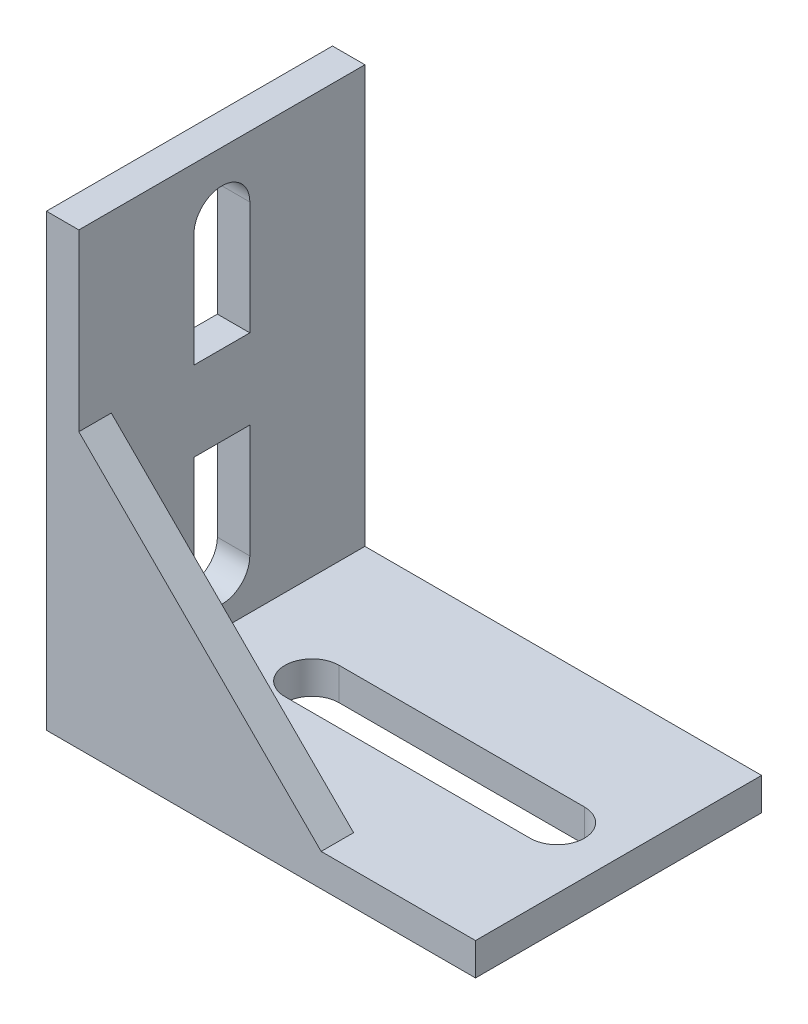
ISO-10303-21;
HEADER;
FILE_DESCRIPTION(('STEP AP214'),'2;1');
FILE_NAME('part.step','',(''),(''),'','','');
FILE_SCHEMA(('AUTOMOTIVE_DESIGN { 1 0 10303 214 1 1 1 1 }'));
ENDSEC;
DATA;
#1=APPLICATION_CONTEXT('core data for automotive mechanical design processes');
#2=APPLICATION_PROTOCOL_DEFINITION('international standard','automotive_design',2000,#1);
#3=PRODUCT_CONTEXT('',#1,'mechanical');
#4=PRODUCT('Part','Part','',(#3));
#5=PRODUCT_RELATED_PRODUCT_CATEGORY('part','',(#4));
#6=PRODUCT_DEFINITION_FORMATION('','',#4);
#7=PRODUCT_DEFINITION_CONTEXT('part definition',#1,'design');
#8=PRODUCT_DEFINITION('design','',#6,#7);
#9=PRODUCT_DEFINITION_SHAPE('','',#8);
#10=(LENGTH_UNIT() NAMED_UNIT(*) SI_UNIT(.MILLI.,.METRE.));
#11=(NAMED_UNIT(*) PLANE_ANGLE_UNIT() SI_UNIT($,.RADIAN.));
#12=(NAMED_UNIT(*) SI_UNIT($,.STERADIAN.) SOLID_ANGLE_UNIT());
#13=UNCERTAINTY_MEASURE_WITH_UNIT(LENGTH_MEASURE(1.E-05),#10,'distance_accuracy_value','');
#14=(GEOMETRIC_REPRESENTATION_CONTEXT(3) GLOBAL_UNCERTAINTY_ASSIGNED_CONTEXT((#13)) GLOBAL_UNIT_ASSIGNED_CONTEXT((#10,
#11,#12)) REPRESENTATION_CONTEXT('',''));
#15=CARTESIAN_POINT('',(0.,0.,0.));
#16=DIRECTION('',(0.,0.,1.));
#17=DIRECTION('',(1.,0.,0.));
#18=AXIS2_PLACEMENT_3D('',#15,#16,#17);
#19=CARTESIAN_POINT('',(7.9375,0.,0.));
#20=DIRECTION('',(1.,0.,0.));
#21=DIRECTION('',(0.,0.,-1.));
#22=AXIS2_PLACEMENT_3D('',#19,#20,#21);
#23=PLANE('',#22);
#24=DIRECTION('',(0.,-1.,0.));
#25=VECTOR('',#24,1.);
#26=CARTESIAN_POINT('',(7.9375,0.,6.83482912030962));
#27=LINE('',#26,#25);
#28=CARTESIAN_POINT('',(7.9375,17.7337008180858,6.83482912030962));
#29=VERTEX_POINT('',#28);
#30=CARTESIAN_POINT('',(7.9375,-10.,6.83482912030962));
#31=VERTEX_POINT('',#30);
#32=EDGE_CURVE('E240',#29,#31,#27,.T.);
#33=ORIENTED_EDGE('',*,*,#32,.F.);
#34=DIRECTION('',(0.,0.,-1.));
#35=VECTOR('',#34,1.);
#36=CARTESIAN_POINT('',(7.9375,17.7337008180858,0.));
#37=LINE('',#36,#35);
#38=CARTESIAN_POINT('',(7.9375,17.7337008180858,-6.83482912030964));
#39=VERTEX_POINT('',#38);
#40=EDGE_CURVE('E243',#29,#39,#37,.T.);
#41=ORIENTED_EDGE('',*,*,#40,.T.);
#42=DIRECTION('',(0.,-1.,0.));
#43=VECTOR('',#42,1.);
#44=CARTESIAN_POINT('',(7.9375,0.,-6.83482912030964));
#45=LINE('',#44,#43);
#46=CARTESIAN_POINT('',(7.9375,-9.99999999999999,-6.83482912030964));
#47=VERTEX_POINT('',#46);
#48=EDGE_CURVE('E247',#39,#47,#45,.T.);
#49=ORIENTED_EDGE('',*,*,#48,.T.);
#50=CARTESIAN_POINT('',(7.9375,-9.99999999999999,0.));
#51=DIRECTION('',(1.,0.,0.));
#52=DIRECTION('',(0.,0.,-1.));
#53=AXIS2_PLACEMENT_3D('',#50,#51,#52);
#54=CIRCLE('',#53,6.83482912030963);
#55=EDGE_CURVE('E249',#31,#47,#54,.T.);
#56=ORIENTED_EDGE('',*,*,#55,.F.);
#57=EDGE_LOOP('',(#33,#41,#49,#56));
#58=FACE_BOUND('',#57,.T.);
#59=DIRECTION('',(0.,0.,-1.));
#60=VECTOR('',#59,1.);
#61=CARTESIAN_POINT('',(7.9375,37.2662991819142,0.));
#62=LINE('',#61,#60);
#63=CARTESIAN_POINT('',(7.9375,37.2662991819142,6.83482912030963));
#64=VERTEX_POINT('',#63);
#65=CARTESIAN_POINT('',(7.9375,37.2662991819142,-6.83482912030963));
#66=VERTEX_POINT('',#65);
#67=EDGE_CURVE('E253',#64,#66,#62,.T.);
#68=ORIENTED_EDGE('',*,*,#67,.F.);
#69=CARTESIAN_POINT('',(7.9375,65.,6.83482912030963));
#70=VERTEX_POINT('',#69);
#71=EDGE_CURVE('E245',#70,#64,#27,.T.);
#72=ORIENTED_EDGE('',*,*,#71,.F.);
#73=CARTESIAN_POINT('',(7.9375,65.,0.));
#74=DIRECTION('',(1.,0.,0.));
#75=DIRECTION('',(0.,0.,-1.));
#76=AXIS2_PLACEMENT_3D('',#73,#74,#75);
#77=CIRCLE('',#76,6.83482912030963);
#78=CARTESIAN_POINT('',(7.9375,65.,-6.83482912030963));
#79=VERTEX_POINT('',#78);
#80=EDGE_CURVE('E256',#79,#70,#77,.T.);
#81=ORIENTED_EDGE('',*,*,#80,.F.);
#82=EDGE_CURVE('E250',#79,#66,#45,.T.);
#83=ORIENTED_EDGE('',*,*,#82,.T.);
#84=EDGE_LOOP('',(#68,#72,#81,#83));
#85=FACE_BOUND('',#84,.T.);
#86=DIRECTION('',(0.,-1.,0.));
#87=VECTOR('',#86,1.);
#88=CARTESIAN_POINT('',(7.9375,0.,35.));
#89=LINE('',#88,#87);
#90=CARTESIAN_POINT('',(7.9375,80.,35.));
#91=VERTEX_POINT('',#90);
#92=CARTESIAN_POINT('',(7.9375,37.2289289259256,35.));
#93=VERTEX_POINT('',#92);
#94=EDGE_CURVE('E55',#91,#93,#89,.T.);
#95=ORIENTED_EDGE('',*,*,#94,.T.);
#96=DIRECTION('',(0.,0.,-1.));
#97=VECTOR('',#96,1.);
#98=CARTESIAN_POINT('',(7.9375,37.2289289259256,0.));
#99=LINE('',#98,#97);
#100=CARTESIAN_POINT('',(7.9375,37.2289289259256,27.0625));
#101=VERTEX_POINT('',#100);
#102=EDGE_CURVE('E50',#93,#101,#99,.T.);
#103=ORIENTED_EDGE('',*,*,#102,.T.);
#104=DIRECTION('',(0.,-1.,0.));
#105=VECTOR('',#104,1.);
#106=CARTESIAN_POINT('',(7.9375,0.,27.0625));
#107=LINE('',#106,#105);
#108=CARTESIAN_POINT('',(7.9375,-22.0625,27.0625));
#109=VERTEX_POINT('',#108);
#110=EDGE_CURVE('E193',#101,#109,#107,.T.);
#111=ORIENTED_EDGE('',*,*,#110,.T.);
#112=DIRECTION('',(0.,0.,1.));
#113=VECTOR('',#112,1.);
#114=CARTESIAN_POINT('',(7.9375,-22.0625,0.));
#115=LINE('',#114,#113);
#116=CARTESIAN_POINT('',(7.9375,-22.0625,-35.));
#117=VERTEX_POINT('',#116);
#118=EDGE_CURVE('E181',#117,#109,#115,.T.);
#119=ORIENTED_EDGE('',*,*,#118,.F.);
#120=DIRECTION('',(0.,-1.,0.));
#121=VECTOR('',#120,1.);
#122=CARTESIAN_POINT('',(7.9375,0.,-35.));
#123=LINE('',#122,#121);
#124=CARTESIAN_POINT('',(7.9375,80.,-35.));
#125=VERTEX_POINT('',#124);
#126=EDGE_CURVE('E259',#125,#117,#123,.T.);
#127=ORIENTED_EDGE('',*,*,#126,.F.);
#128=DIRECTION('',(0.,0.,-1.));
#129=VECTOR('',#128,1.);
#130=CARTESIAN_POINT('',(7.9375,80.,0.));
#131=LINE('',#130,#129);
#132=EDGE_CURVE('E262',#91,#125,#131,.T.);
#133=ORIENTED_EDGE('',*,*,#132,.F.);
#134=EDGE_LOOP('',(#95,#103,#111,#119,#127,#133));
#135=FACE_BOUND('',#134,.T.);
#136=ADVANCED_FACE('F35',(#58,#85,#135),#23,.T.);
#137=CARTESIAN_POINT('',(0.,-22.0625,0.));
#138=DIRECTION('',(0.,-1.,0.));
#139=DIRECTION('',(0.,0.,-1.));
#140=AXIS2_PLACEMENT_3D('',#137,#138,#139);
#141=PLANE('',#140);
#142=CARTESIAN_POINT('',(90.,-22.0625,0.));
#143=DIRECTION('',(0.,-1.,0.));
#144=DIRECTION('',(0.,0.,-1.));
#145=AXIS2_PLACEMENT_3D('',#142,#143,#144);
#146=CIRCLE('',#145,6.64034916170633);
#147=CARTESIAN_POINT('',(90.,-22.0625,-6.64034916170633));
#148=VERTEX_POINT('',#147);
#149=CARTESIAN_POINT('',(90.,-22.0625,6.64034916170633));
#150=VERTEX_POINT('',#149);
#151=EDGE_CURVE('E199',#148,#150,#146,.T.);
#152=ORIENTED_EDGE('',*,*,#151,.T.);
#153=DIRECTION('',(1.,0.,0.));
#154=VECTOR('',#153,1.);
#155=CARTESIAN_POINT('',(0.,-22.0625,6.64034916170633));
#156=LINE('',#155,#154);
#157=CARTESIAN_POINT('',(30.,-22.0625,6.64034916170633));
#158=VERTEX_POINT('',#157);
#159=EDGE_CURVE('E206',#158,#150,#156,.T.);
#160=ORIENTED_EDGE('',*,*,#159,.F.);
#161=CARTESIAN_POINT('',(30.,-22.0625,0.));
#162=DIRECTION('',(0.,-1.,0.));
#163=DIRECTION('',(0.,0.,-1.));
#164=AXIS2_PLACEMENT_3D('',#161,#162,#163);
#165=CIRCLE('',#164,6.64034916170633);
#166=CARTESIAN_POINT('',(30.,-22.0625,-6.64034916170633));
#167=VERTEX_POINT('',#166);
#168=EDGE_CURVE('E204',#158,#167,#165,.T.);
#169=ORIENTED_EDGE('',*,*,#168,.T.);
#170=DIRECTION('',(1.,0.,0.));
#171=VECTOR('',#170,1.);
#172=CARTESIAN_POINT('',(0.,-22.0625,-6.64034916170633));
#173=LINE('',#172,#171);
#174=EDGE_CURVE('E201',#167,#148,#173,.T.);
#175=ORIENTED_EDGE('',*,*,#174,.T.);
#176=EDGE_LOOP('',(#152,#160,#169,#175));
#177=FACE_BOUND('',#176,.T.);
#178=DIRECTION('',(0.,0.,-1.));
#179=VECTOR('',#178,1.);
#180=CARTESIAN_POINT('',(67.2289289259262,-22.0625,0.));
#181=LINE('',#180,#179);
#182=CARTESIAN_POINT('',(67.2289289259262,-22.0625,35.));
#183=VERTEX_POINT('',#182);
#184=CARTESIAN_POINT('',(67.2289289259262,-22.0625,27.0625));
#185=VERTEX_POINT('',#184);
#186=EDGE_CURVE('E11',#183,#185,#181,.T.);
#187=ORIENTED_EDGE('',*,*,#186,.F.);
#188=DIRECTION('',(1.,0.,0.));
#189=VECTOR('',#188,1.);
#190=CARTESIAN_POINT('',(0.,-22.0625,35.));
#191=LINE('',#190,#189);
#192=CARTESIAN_POINT('',(105.,-22.0625,35.));
#193=VERTEX_POINT('',#192);
#194=EDGE_CURVE('E171',#183,#193,#191,.T.);
#195=ORIENTED_EDGE('',*,*,#194,.T.);
#196=DIRECTION('',(0.,0.,-1.));
#197=VECTOR('',#196,1.);
#198=CARTESIAN_POINT('',(105.,-22.0625,0.));
#199=LINE('',#198,#197);
#200=CARTESIAN_POINT('',(105.,-22.0625,-35.));
#201=VERTEX_POINT('',#200);
#202=EDGE_CURVE('E182',#193,#201,#199,.T.);
#203=ORIENTED_EDGE('',*,*,#202,.T.);
#204=DIRECTION('',(1.,0.,0.));
#205=VECTOR('',#204,1.);
#206=CARTESIAN_POINT('',(0.,-22.0625,-35.));
#207=LINE('',#206,#205);
#208=EDGE_CURVE('E211',#117,#201,#207,.T.);
#209=ORIENTED_EDGE('',*,*,#208,.F.);
#210=ORIENTED_EDGE('',*,*,#118,.T.);
#211=DIRECTION('',(-1.,0.,0.));
#212=VECTOR('',#211,1.);
#213=CARTESIAN_POINT('',(0.,-22.0625,27.0625));
#214=LINE('',#213,#212);
#215=EDGE_CURVE('E43',#185,#109,#214,.T.);
#216=ORIENTED_EDGE('',*,*,#215,.F.);
#217=EDGE_LOOP('',(#187,#195,#203,#209,#210,#216));
#218=FACE_BOUND('',#217,.T.);
#219=ADVANCED_FACE('F184',(#177,#218),#141,.F.);
#220=CARTESIAN_POINT('',(7.9375,0.,-35.));
#221=DIRECTION('',(0.,0.,-1.));
#222=DIRECTION('',(-1.,0.,0.));
#223=AXIS2_PLACEMENT_3D('',#220,#221,#222);
#224=PLANE('',#223);
#225=DIRECTION('',(0.,-1.,0.));
#226=VECTOR('',#225,1.);
#227=CARTESIAN_POINT('',(0.,0.,-35.));
#228=LINE('',#227,#226);
#229=CARTESIAN_POINT('',(0.,80.,-35.));
#230=VERTEX_POINT('',#229);
#231=CARTESIAN_POINT('',(0.,-30.,-35.));
#232=VERTEX_POINT('',#231);
#233=EDGE_CURVE('E285',#230,#232,#228,.T.);
#234=ORIENTED_EDGE('',*,*,#233,.F.);
#235=DIRECTION('',(-1.,0.,0.));
#236=VECTOR('',#235,1.);
#237=CARTESIAN_POINT('',(7.9375,80.,-35.));
#238=LINE('',#237,#236);
#239=EDGE_CURVE('E302',#125,#230,#238,.T.);
#240=ORIENTED_EDGE('',*,*,#239,.F.);
#241=ORIENTED_EDGE('',*,*,#126,.T.);
#242=ORIENTED_EDGE('',*,*,#208,.T.);
#243=DIRECTION('',(0.,-1.,0.));
#244=VECTOR('',#243,1.);
#245=CARTESIAN_POINT('',(105.,-22.0625,-35.));
#246=LINE('',#245,#244);
#247=CARTESIAN_POINT('',(105.,-30.,-35.));
#248=VERTEX_POINT('',#247);
#249=EDGE_CURVE('E226',#201,#248,#246,.T.);
#250=ORIENTED_EDGE('',*,*,#249,.T.);
#251=DIRECTION('',(-1.,0.,0.));
#252=VECTOR('',#251,1.);
#253=CARTESIAN_POINT('',(7.9375,-30.,-35.));
#254=LINE('',#253,#252);
#255=EDGE_CURVE('E294',#248,#232,#254,.T.);
#256=ORIENTED_EDGE('',*,*,#255,.T.);
#257=EDGE_LOOP('',(#234,#240,#241,#242,#250,#256));
#258=FACE_BOUND('',#257,.T.);
#259=ADVANCED_FACE('F325',(#258),#224,.T.);
#260=CARTESIAN_POINT('',(7.9375,80.,0.));
#261=DIRECTION('',(0.,1.,0.));
#262=DIRECTION('',(0.,0.,1.));
#263=AXIS2_PLACEMENT_3D('',#260,#261,#262);
#264=PLANE('',#263);
#265=DIRECTION('',(0.,0.,-1.));
#266=VECTOR('',#265,1.);
#267=CARTESIAN_POINT('',(0.,80.,0.));
#268=LINE('',#267,#266);
#269=CARTESIAN_POINT('',(0.,80.,35.));
#270=VERTEX_POINT('',#269);
#271=EDGE_CURVE('E288',#270,#230,#268,.T.);
#272=ORIENTED_EDGE('',*,*,#271,.F.);
#273=DIRECTION('',(-1.,0.,0.));
#274=VECTOR('',#273,1.);
#275=CARTESIAN_POINT('',(7.9375,80.,35.));
#276=LINE('',#275,#274);
#277=EDGE_CURVE('E300',#91,#270,#276,.T.);
#278=ORIENTED_EDGE('',*,*,#277,.F.);
#279=ORIENTED_EDGE('',*,*,#132,.T.);
#280=ORIENTED_EDGE('',*,*,#239,.T.);
#281=EDGE_LOOP('',(#272,#278,#279,#280));
#282=FACE_BOUND('',#281,.T.);
#283=ADVANCED_FACE('F328',(#282),#264,.T.);
#284=CARTESIAN_POINT('',(7.9375,0.,35.));
#285=DIRECTION('',(0.,0.,-1.));
#286=DIRECTION('',(-1.,0.,0.));
#287=AXIS2_PLACEMENT_3D('',#284,#285,#286);
#288=PLANE('',#287);
#289=DIRECTION('',(0.,-1.,0.));
#290=VECTOR('',#289,1.);
#291=CARTESIAN_POINT('',(0.,0.,35.));
#292=LINE('',#291,#290);
#293=CARTESIAN_POINT('',(0.,-30.,35.));
#294=VERTEX_POINT('',#293);
#295=EDGE_CURVE('E291',#270,#294,#292,.T.);
#296=ORIENTED_EDGE('',*,*,#295,.T.);
#297=DIRECTION('',(-1.,0.,0.));
#298=VECTOR('',#297,1.);
#299=CARTESIAN_POINT('',(7.9375,-30.,35.));
#300=LINE('',#299,#298);
#301=CARTESIAN_POINT('',(105.,-30.,35.));
#302=VERTEX_POINT('',#301);
#303=EDGE_CURVE('E297',#302,#294,#300,.T.);
#304=ORIENTED_EDGE('',*,*,#303,.F.);
#305=DIRECTION('',(0.,-1.,0.));
#306=VECTOR('',#305,1.);
#307=CARTESIAN_POINT('',(105.,-22.0625,35.));
#308=LINE('',#307,#306);
#309=EDGE_CURVE('E178',#193,#302,#308,.T.);
#310=ORIENTED_EDGE('',*,*,#309,.F.);
#311=ORIENTED_EDGE('',*,*,#194,.F.);
#312=DIRECTION('',(0.707106781186551,-0.707106781186544,0.));
#313=VECTOR('',#312,1.);
#314=CARTESIAN_POINT('',(0.,45.1664289259255,35.));
#315=LINE('',#314,#313);
#316=EDGE_CURVE('E176',#93,#183,#315,.T.);
#317=ORIENTED_EDGE('',*,*,#316,.F.);
#318=ORIENTED_EDGE('',*,*,#94,.F.);
#319=ORIENTED_EDGE('',*,*,#277,.T.);
#320=EDGE_LOOP('',(#296,#304,#310,#311,#317,#318,#319));
#321=FACE_BOUND('',#320,.T.);
#322=ADVANCED_FACE('F174',(#321),#288,.F.);
#323=CARTESIAN_POINT('',(7.9375,37.2662991819142,0.));
#324=DIRECTION('',(0.,1.,0.));
#325=DIRECTION('',(0.,0.,1.));
#326=AXIS2_PLACEMENT_3D('',#323,#324,#325);
#327=PLANE('',#326);
#328=DIRECTION('',(0.,0.,-1.));
#329=VECTOR('',#328,1.);
#330=CARTESIAN_POINT('',(0.,37.2662991819142,0.));
#331=LINE('',#330,#329);
#332=CARTESIAN_POINT('',(0.,37.2662991819142,6.83482912030963));
#333=VERTEX_POINT('',#332);
#334=CARTESIAN_POINT('',(0.,37.2662991819142,-6.83482912030963));
#335=VERTEX_POINT('',#334);
#336=EDGE_CURVE('E279',#333,#335,#331,.T.);
#337=ORIENTED_EDGE('',*,*,#336,.F.);
#338=DIRECTION('',(-1.,0.,0.));
#339=VECTOR('',#338,1.);
#340=CARTESIAN_POINT('',(7.9375,37.2662991819142,6.83482912030963));
#341=LINE('',#340,#339);
#342=EDGE_CURVE('E298',#64,#333,#341,.T.);
#343=ORIENTED_EDGE('',*,*,#342,.F.);
#344=ORIENTED_EDGE('',*,*,#67,.T.);
#345=DIRECTION('',(-1.,0.,0.));
#346=VECTOR('',#345,1.);
#347=CARTESIAN_POINT('',(7.9375,37.2662991819142,-6.83482912030963));
#348=LINE('',#347,#346);
#349=EDGE_CURVE('E304',#66,#335,#348,.T.);
#350=ORIENTED_EDGE('',*,*,#349,.T.);
#351=EDGE_LOOP('',(#337,#343,#344,#350));
#352=FACE_BOUND('',#351,.T.);
#353=ADVANCED_FACE('F369',(#352),#327,.T.);
#354=CARTESIAN_POINT('',(7.9375,0.,6.83482912030962));
#355=DIRECTION('',(0.,0.,-1.));
#356=DIRECTION('',(0.,1.,0.));
#357=AXIS2_PLACEMENT_3D('',#354,#355,#356);
#358=PLANE('',#357);
#359=DIRECTION('',(0.,-1.,0.));
#360=VECTOR('',#359,1.);
#361=CARTESIAN_POINT('',(0.,0.,6.83482912030962));
#362=LINE('',#361,#360);
#363=CARTESIAN_POINT('',(0.,65.,6.83482912030963));
#364=VERTEX_POINT('',#363);
#365=EDGE_CURVE('E270',#364,#333,#362,.T.);
#366=ORIENTED_EDGE('',*,*,#365,.F.);
#367=DIRECTION('',(-1.,0.,0.));
#368=VECTOR('',#367,1.);
#369=CARTESIAN_POINT('',(7.9375,65.,6.83482912030963));
#370=LINE('',#369,#368);
#371=EDGE_CURVE('E309',#70,#364,#370,.T.);
#372=ORIENTED_EDGE('',*,*,#371,.F.);
#373=ORIENTED_EDGE('',*,*,#71,.T.);
#374=ORIENTED_EDGE('',*,*,#342,.T.);
#375=EDGE_LOOP('',(#366,#372,#373,#374));
#376=FACE_BOUND('',#375,.T.);
#377=ADVANCED_FACE('F383',(#376),#358,.T.);
#378=CARTESIAN_POINT('',(7.9375,65.,0.));
#379=DIRECTION('',(-1.,0.,0.));
#380=DIRECTION('',(0.,0.,1.));
#381=AXIS2_PLACEMENT_3D('',#378,#379,#380);
#382=CYLINDRICAL_SURFACE('',#381,6.83482912030963);
#383=CARTESIAN_POINT('',(0.,65.,0.));
#384=DIRECTION('',(1.,0.,0.));
#385=DIRECTION('',(0.,0.,-1.));
#386=AXIS2_PLACEMENT_3D('',#383,#384,#385);
#387=CIRCLE('',#386,6.83482912030963);
#388=CARTESIAN_POINT('',(0.,65.,-6.83482912030963));
#389=VERTEX_POINT('',#388);
#390=EDGE_CURVE('E282',#389,#364,#387,.T.);
#391=ORIENTED_EDGE('',*,*,#390,.F.);
#392=DIRECTION('',(-1.,0.,0.));
#393=VECTOR('',#392,1.);
#394=CARTESIAN_POINT('',(7.9375,65.,-6.83482912030963));
#395=LINE('',#394,#393);
#396=EDGE_CURVE('E306',#79,#389,#395,.T.);
#397=ORIENTED_EDGE('',*,*,#396,.F.);
#398=ORIENTED_EDGE('',*,*,#80,.T.);
#399=ORIENTED_EDGE('',*,*,#371,.T.);
#400=EDGE_LOOP('',(#391,#397,#398,#399));
#401=FACE_BOUND('',#400,.T.);
#402=ADVANCED_FACE('F379',(#401),#382,.F.);
#403=CARTESIAN_POINT('',(0.,17.7337008180858,6.83482912030962));
#404=VERTEX_POINT('',#403);
#405=CARTESIAN_POINT('',(0.,-10.,6.83482912030962));
#406=VERTEX_POINT('',#405);
#407=EDGE_CURVE('E229',#404,#406,#362,.T.);
#408=ORIENTED_EDGE('',*,*,#407,.F.);
#409=DIRECTION('',(-1.,0.,0.));
#410=VECTOR('',#409,1.);
#411=CARTESIAN_POINT('',(7.9375,17.7337008180858,6.83482912030962));
#412=LINE('',#411,#410);
#413=EDGE_CURVE('E307',#29,#404,#412,.T.);
#414=ORIENTED_EDGE('',*,*,#413,.F.);
#415=ORIENTED_EDGE('',*,*,#32,.T.);
#416=DIRECTION('',(-1.,0.,0.));
#417=VECTOR('',#416,1.);
#418=CARTESIAN_POINT('',(7.9375,-10.,6.83482912030962));
#419=LINE('',#418,#417);
#420=EDGE_CURVE('E266',#31,#406,#419,.T.);
#421=ORIENTED_EDGE('',*,*,#420,.T.);
#422=EDGE_LOOP('',(#408,#414,#415,#421));
#423=FACE_BOUND('',#422,.T.);
#424=ADVANCED_FACE('F382',(#423),#358,.T.);
#425=CARTESIAN_POINT('',(7.9375,17.7337008180858,0.));
#426=DIRECTION('',(0.,1.,0.));
#427=DIRECTION('',(0.,0.,1.));
#428=AXIS2_PLACEMENT_3D('',#425,#426,#427);
#429=PLANE('',#428);
#430=DIRECTION('',(0.,0.,-1.));
#431=VECTOR('',#430,1.);
#432=CARTESIAN_POINT('',(0.,17.7337008180858,0.));
#433=LINE('',#432,#431);
#434=CARTESIAN_POINT('',(0.,17.7337008180858,-6.83482912030964));
#435=VERTEX_POINT('',#434);
#436=EDGE_CURVE('E269',#404,#435,#433,.T.);
#437=ORIENTED_EDGE('',*,*,#436,.T.);
#438=DIRECTION('',(-1.,0.,0.));
#439=VECTOR('',#438,1.);
#440=CARTESIAN_POINT('',(7.9375,17.7337008180858,-6.83482912030964));
#441=LINE('',#440,#439);
#442=EDGE_CURVE('E315',#39,#435,#441,.T.);
#443=ORIENTED_EDGE('',*,*,#442,.F.);
#444=ORIENTED_EDGE('',*,*,#40,.F.);
#445=ORIENTED_EDGE('',*,*,#413,.T.);
#446=EDGE_LOOP('',(#437,#443,#444,#445));
#447=FACE_BOUND('',#446,.T.);
#448=ADVANCED_FACE('F37',(#447),#429,.F.);
#449=CARTESIAN_POINT('',(7.9375,0.,-6.83482912030964));
#450=DIRECTION('',(0.,0.,-1.));
#451=DIRECTION('',(0.,1.,0.));
#452=AXIS2_PLACEMENT_3D('',#449,#450,#451);
#453=PLANE('',#452);
#454=DIRECTION('',(0.,-1.,0.));
#455=VECTOR('',#454,1.);
#456=CARTESIAN_POINT('',(0.,0.,-6.83482912030964));
#457=LINE('',#456,#455);
#458=CARTESIAN_POINT('',(0.,-9.99999999999999,-6.83482912030964));
#459=VERTEX_POINT('',#458);
#460=EDGE_CURVE('E272',#435,#459,#457,.T.);
#461=ORIENTED_EDGE('',*,*,#460,.T.);
#462=DIRECTION('',(-1.,0.,0.));
#463=VECTOR('',#462,1.);
#464=CARTESIAN_POINT('',(7.9375,-9.99999999999999,-6.83482912030964));
#465=LINE('',#464,#463);
#466=EDGE_CURVE('E313',#47,#459,#465,.T.);
#467=ORIENTED_EDGE('',*,*,#466,.F.);
#468=ORIENTED_EDGE('',*,*,#48,.F.);
#469=ORIENTED_EDGE('',*,*,#442,.T.);
#470=EDGE_LOOP('',(#461,#467,#468,#469));
#471=FACE_BOUND('',#470,.T.);
#472=ADVANCED_FACE('F377',(#471),#453,.F.);
#473=EDGE_CURVE('E276',#389,#335,#457,.T.);
#474=ORIENTED_EDGE('',*,*,#473,.T.);
#475=ORIENTED_EDGE('',*,*,#349,.F.);
#476=ORIENTED_EDGE('',*,*,#82,.F.);
#477=ORIENTED_EDGE('',*,*,#396,.T.);
#478=EDGE_LOOP('',(#474,#475,#476,#477));
#479=FACE_BOUND('',#478,.T.);
#480=ADVANCED_FACE('F374',(#479),#453,.F.);
#481=CARTESIAN_POINT('',(7.9375,-9.99999999999999,0.));
#482=DIRECTION('',(-1.,0.,0.));
#483=DIRECTION('',(0.,0.,1.));
#484=AXIS2_PLACEMENT_3D('',#481,#482,#483);
#485=CYLINDRICAL_SURFACE('',#484,6.83482912030963);
#486=CARTESIAN_POINT('',(0.,-9.99999999999999,0.));
#487=DIRECTION('',(1.,0.,0.));
#488=DIRECTION('',(0.,0.,-1.));
#489=AXIS2_PLACEMENT_3D('',#486,#487,#488);
#490=CIRCLE('',#489,6.83482912030963);
#491=EDGE_CURVE('E275',#406,#459,#490,.T.);
#492=ORIENTED_EDGE('',*,*,#491,.F.);
#493=ORIENTED_EDGE('',*,*,#420,.F.);
#494=ORIENTED_EDGE('',*,*,#55,.T.);
#495=ORIENTED_EDGE('',*,*,#466,.T.);
#496=EDGE_LOOP('',(#492,#493,#494,#495));
#497=FACE_BOUND('',#496,.T.);
#498=ADVANCED_FACE('F366',(#497),#485,.F.);
#499=CARTESIAN_POINT('',(7.9375,-30.,0.));
#500=DIRECTION('',(0.,1.,0.));
#501=DIRECTION('',(0.,0.,1.));
#502=AXIS2_PLACEMENT_3D('',#499,#500,#501);
#503=PLANE('',#502);
#504=ORIENTED_EDGE('',*,*,#303,.T.);
#505=DIRECTION('',(0.,0.,-1.));
#506=VECTOR('',#505,1.);
#507=CARTESIAN_POINT('',(0.,-30.,0.));
#508=LINE('',#507,#506);
#509=EDGE_CURVE('E244',#294,#232,#508,.T.);
#510=ORIENTED_EDGE('',*,*,#509,.T.);
#511=ORIENTED_EDGE('',*,*,#255,.F.);
#512=DIRECTION('',(0.,0.,-1.));
#513=VECTOR('',#512,1.);
#514=CARTESIAN_POINT('',(105.,-30.,0.));
#515=LINE('',#514,#513);
#516=EDGE_CURVE('E202',#302,#248,#515,.T.);
#517=ORIENTED_EDGE('',*,*,#516,.F.);
#518=EDGE_LOOP('',(#504,#510,#511,#517));
#519=FACE_BOUND('',#518,.T.);
#520=CARTESIAN_POINT('',(90.,-30.,0.));
#521=DIRECTION('',(0.,-1.,0.));
#522=DIRECTION('',(0.,0.,-1.));
#523=AXIS2_PLACEMENT_3D('',#520,#521,#522);
#524=CIRCLE('',#523,6.64034916170633);
#525=CARTESIAN_POINT('',(90.,-30.,-6.64034916170633));
#526=VERTEX_POINT('',#525);
#527=CARTESIAN_POINT('',(90.,-30.,6.64034916170633));
#528=VERTEX_POINT('',#527);
#529=EDGE_CURVE('E198',#526,#528,#524,.T.);
#530=ORIENTED_EDGE('',*,*,#529,.F.);
#531=DIRECTION('',(1.,0.,0.));
#532=VECTOR('',#531,1.);
#533=CARTESIAN_POINT('',(0.,-30.,-6.64034916170633));
#534=LINE('',#533,#532);
#535=CARTESIAN_POINT('',(30.,-30.,-6.64034916170633));
#536=VERTEX_POINT('',#535);
#537=EDGE_CURVE('E217',#536,#526,#534,.T.);
#538=ORIENTED_EDGE('',*,*,#537,.F.);
#539=CARTESIAN_POINT('',(30.,-30.,0.));
#540=DIRECTION('',(0.,-1.,0.));
#541=DIRECTION('',(0.,0.,-1.));
#542=AXIS2_PLACEMENT_3D('',#539,#540,#541);
#543=CIRCLE('',#542,6.64034916170633);
#544=CARTESIAN_POINT('',(30.,-30.,6.64034916170633));
#545=VERTEX_POINT('',#544);
#546=EDGE_CURVE('E219',#545,#536,#543,.T.);
#547=ORIENTED_EDGE('',*,*,#546,.F.);
#548=DIRECTION('',(1.,0.,0.));
#549=VECTOR('',#548,1.);
#550=CARTESIAN_POINT('',(0.,-30.,6.64034916170633));
#551=LINE('',#550,#549);
#552=EDGE_CURVE('E221',#545,#528,#551,.T.);
#553=ORIENTED_EDGE('',*,*,#552,.T.);
#554=EDGE_LOOP('',(#530,#538,#547,#553));
#555=FACE_BOUND('',#554,.T.);
#556=ADVANCED_FACE('F335',(#519,#555),#503,.F.);
#557=CARTESIAN_POINT('',(0.,0.,0.));
#558=DIRECTION('',(1.,0.,0.));
#559=DIRECTION('',(0.,0.,-1.));
#560=AXIS2_PLACEMENT_3D('',#557,#558,#559);
#561=PLANE('',#560);
#562=ORIENTED_EDGE('',*,*,#509,.F.);
#563=ORIENTED_EDGE('',*,*,#295,.F.);
#564=ORIENTED_EDGE('',*,*,#271,.T.);
#565=ORIENTED_EDGE('',*,*,#233,.T.);
#566=EDGE_LOOP('',(#562,#563,#564,#565));
#567=FACE_BOUND('',#566,.T.);
#568=ORIENTED_EDGE('',*,*,#336,.T.);
#569=ORIENTED_EDGE('',*,*,#473,.F.);
#570=ORIENTED_EDGE('',*,*,#390,.T.);
#571=ORIENTED_EDGE('',*,*,#365,.T.);
#572=EDGE_LOOP('',(#568,#569,#570,#571));
#573=FACE_BOUND('',#572,.T.);
#574=ORIENTED_EDGE('',*,*,#407,.T.);
#575=ORIENTED_EDGE('',*,*,#491,.T.);
#576=ORIENTED_EDGE('',*,*,#460,.F.);
#577=ORIENTED_EDGE('',*,*,#436,.F.);
#578=EDGE_LOOP('',(#574,#575,#576,#577));
#579=FACE_BOUND('',#578,.T.);
#580=ADVANCED_FACE('F332',(#567,#573,#579),#561,.F.);
#581=CARTESIAN_POINT('',(105.,-22.0625,0.));
#582=DIRECTION('',(-1.,0.,0.));
#583=DIRECTION('',(0.,0.,1.));
#584=AXIS2_PLACEMENT_3D('',#581,#582,#583);
#585=PLANE('',#584);
#586=ORIENTED_EDGE('',*,*,#516,.T.);
#587=ORIENTED_EDGE('',*,*,#249,.F.);
#588=ORIENTED_EDGE('',*,*,#202,.F.);
#589=ORIENTED_EDGE('',*,*,#309,.T.);
#590=EDGE_LOOP('',(#586,#587,#588,#589));
#591=FACE_BOUND('',#590,.T.);
#592=ADVANCED_FACE('F339',(#591),#585,.F.);
#593=CARTESIAN_POINT('',(90.,-22.0625,0.));
#594=DIRECTION('',(0.,-1.,0.));
#595=DIRECTION('',(0.,0.,-1.));
#596=AXIS2_PLACEMENT_3D('',#593,#594,#595);
#597=CYLINDRICAL_SURFACE('',#596,6.64034916170633);
#598=ORIENTED_EDGE('',*,*,#529,.T.);
#599=DIRECTION('',(0.,-1.,0.));
#600=VECTOR('',#599,1.);
#601=CARTESIAN_POINT('',(90.,-22.0625,6.64034916170633));
#602=LINE('',#601,#600);
#603=EDGE_CURVE('E231',#150,#528,#602,.T.);
#604=ORIENTED_EDGE('',*,*,#603,.F.);
#605=ORIENTED_EDGE('',*,*,#151,.F.);
#606=DIRECTION('',(0.,-1.,0.));
#607=VECTOR('',#606,1.);
#608=CARTESIAN_POINT('',(90.,-22.0625,-6.64034916170633));
#609=LINE('',#608,#607);
#610=EDGE_CURVE('E214',#148,#526,#609,.T.);
#611=ORIENTED_EDGE('',*,*,#610,.T.);
#612=EDGE_LOOP('',(#598,#604,#605,#611));
#613=FACE_BOUND('',#612,.T.);
#614=ADVANCED_FACE('F341',(#613),#597,.F.);
#615=CARTESIAN_POINT('',(0.,-22.0625,6.64034916170633));
#616=DIRECTION('',(0.,0.,-1.));
#617=DIRECTION('',(-1.,0.,0.));
#618=AXIS2_PLACEMENT_3D('',#615,#616,#617);
#619=PLANE('',#618);
#620=ORIENTED_EDGE('',*,*,#552,.F.);
#621=DIRECTION('',(0.,-1.,0.));
#622=VECTOR('',#621,1.);
#623=CARTESIAN_POINT('',(30.,-22.0625,6.64034916170633));
#624=LINE('',#623,#622);
#625=EDGE_CURVE('E233',#158,#545,#624,.T.);
#626=ORIENTED_EDGE('',*,*,#625,.F.);
#627=ORIENTED_EDGE('',*,*,#159,.T.);
#628=ORIENTED_EDGE('',*,*,#603,.T.);
#629=EDGE_LOOP('',(#620,#626,#627,#628));
#630=FACE_BOUND('',#629,.T.);
#631=ADVANCED_FACE('F347',(#630),#619,.T.);
#632=CARTESIAN_POINT('',(30.,-22.0625,0.));
#633=DIRECTION('',(0.,-1.,0.));
#634=DIRECTION('',(0.,0.,-1.));
#635=AXIS2_PLACEMENT_3D('',#632,#633,#634);
#636=CYLINDRICAL_SURFACE('',#635,6.64034916170633);
#637=ORIENTED_EDGE('',*,*,#546,.T.);
#638=DIRECTION('',(0.,-1.,0.));
#639=VECTOR('',#638,1.);
#640=CARTESIAN_POINT('',(30.,-22.0625,-6.64034916170633));
#641=LINE('',#640,#639);
#642=EDGE_CURVE('E235',#167,#536,#641,.T.);
#643=ORIENTED_EDGE('',*,*,#642,.F.);
#644=ORIENTED_EDGE('',*,*,#168,.F.);
#645=ORIENTED_EDGE('',*,*,#625,.T.);
#646=EDGE_LOOP('',(#637,#643,#644,#645));
#647=FACE_BOUND('',#646,.T.);
#648=ADVANCED_FACE('F458',(#647),#636,.F.);
#649=CARTESIAN_POINT('',(0.,-22.0625,-6.64034916170633));
#650=DIRECTION('',(0.,0.,-1.));
#651=DIRECTION('',(-1.,0.,0.));
#652=AXIS2_PLACEMENT_3D('',#649,#650,#651);
#653=PLANE('',#652);
#654=ORIENTED_EDGE('',*,*,#537,.T.);
#655=ORIENTED_EDGE('',*,*,#610,.F.);
#656=ORIENTED_EDGE('',*,*,#174,.F.);
#657=ORIENTED_EDGE('',*,*,#642,.T.);
#658=EDGE_LOOP('',(#654,#655,#656,#657));
#659=FACE_BOUND('',#658,.T.);
#660=ADVANCED_FACE('F454',(#659),#653,.F.);
#661=CARTESIAN_POINT('',(0.,45.1664289259255,27.0625));
#662=DIRECTION('',(-0.707106781186544,-0.707106781186551,0.));
#663=DIRECTION('',(0.707106781186551,-0.707106781186544,0.));
#664=AXIS2_PLACEMENT_3D('',#661,#662,#663);
#665=PLANE('',#664);
#666=ORIENTED_EDGE('',*,*,#102,.F.);
#667=ORIENTED_EDGE('',*,*,#316,.T.);
#668=ORIENTED_EDGE('',*,*,#186,.T.);
#669=DIRECTION('',(0.707106781186551,-0.707106781186544,0.));
#670=VECTOR('',#669,1.);
#671=CARTESIAN_POINT('',(0.,45.1664289259255,27.0625));
#672=LINE('',#671,#670);
#673=EDGE_CURVE('E191',#101,#185,#672,.T.);
#674=ORIENTED_EDGE('',*,*,#673,.F.);
#675=EDGE_LOOP('',(#666,#667,#668,#674));
#676=FACE_BOUND('',#675,.T.);
#677=ADVANCED_FACE('F190',(#676),#665,.F.);
#678=CARTESIAN_POINT('',(0.,0.,27.0625));
#679=DIRECTION('',(0.,0.,1.));
#680=DIRECTION('',(1.,0.,0.));
#681=AXIS2_PLACEMENT_3D('',#678,#679,#680);
#682=PLANE('',#681);
#683=ORIENTED_EDGE('',*,*,#110,.F.);
#684=ORIENTED_EDGE('',*,*,#673,.T.);
#685=ORIENTED_EDGE('',*,*,#215,.T.);
#686=EDGE_LOOP('',(#683,#684,#685));
#687=FACE_BOUND('',#686,.T.);
#688=ADVANCED_FACE('F319',(#687),#682,.F.);
#689=CLOSED_SHELL('',(#136,#219,#259,#283,#322,#353,#377,#402,#424,#448,#472,#480,#498,#556,
#580,#592,#614,#631,#648,#660,#677,#688));
#690=MANIFOLD_SOLID_BREP('B2',#689);
#691=ADVANCED_BREP_SHAPE_REPRESENTATION('',(#18,#690),#14);
#692=SHAPE_DEFINITION_REPRESENTATION(#9,#691);
ENDSEC;
END-ISO-10303-21;
